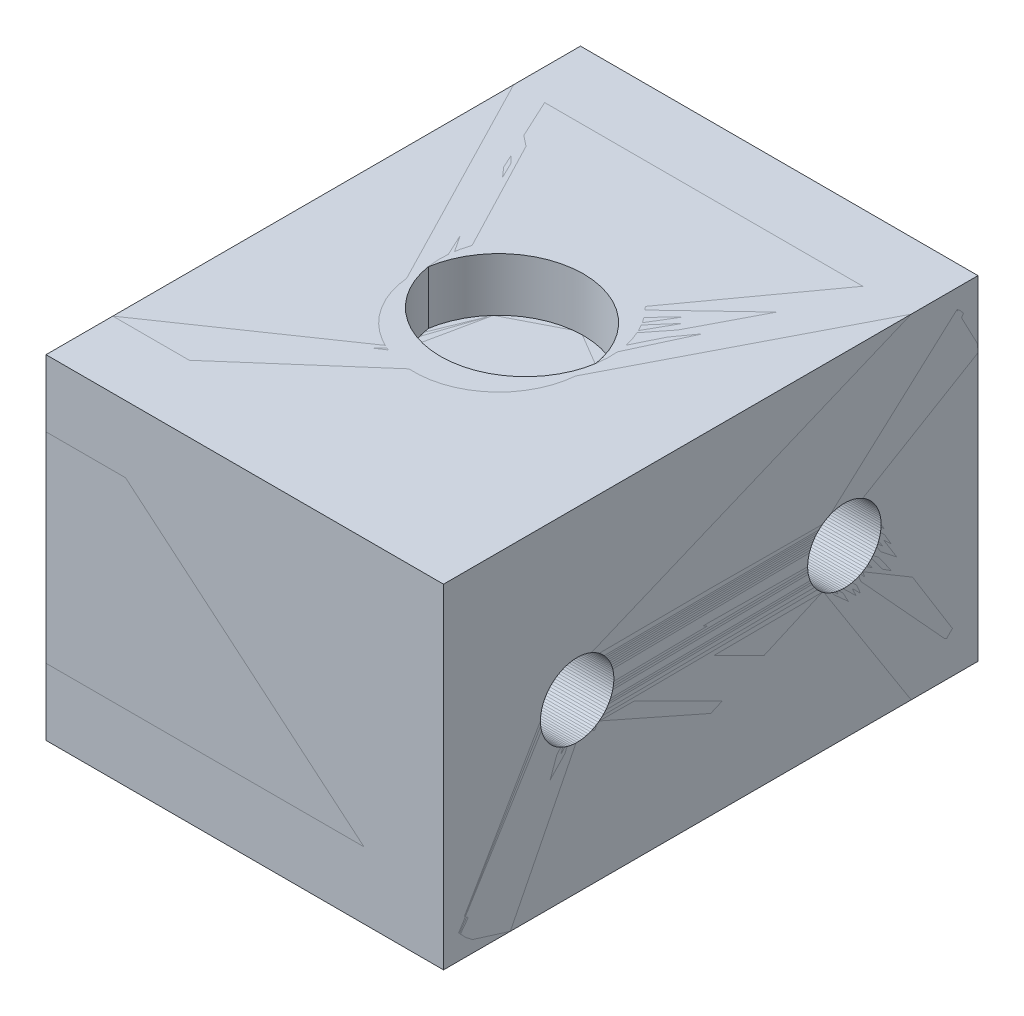
ISO-10303-21;
HEADER;
FILE_DESCRIPTION(('STEP AP214'),'2;1');
FILE_NAME('part.step','',(''),(''),'','','');
FILE_SCHEMA(('AUTOMOTIVE_DESIGN { 1 0 10303 214 1 1 1 1 }'));
ENDSEC;
DATA;
#1=APPLICATION_CONTEXT('core data for automotive mechanical design processes');
#2=APPLICATION_PROTOCOL_DEFINITION('international standard','automotive_design',2000,#1);
#3=PRODUCT_CONTEXT('',#1,'mechanical');
#4=PRODUCT('Part','Part','',(#3));
#5=PRODUCT_RELATED_PRODUCT_CATEGORY('part','',(#4));
#6=PRODUCT_DEFINITION_FORMATION('','',#4);
#7=PRODUCT_DEFINITION_CONTEXT('part definition',#1,'design');
#8=PRODUCT_DEFINITION('design','',#6,#7);
#9=PRODUCT_DEFINITION_SHAPE('','',#8);
#10=(LENGTH_UNIT() NAMED_UNIT(*) SI_UNIT(.MILLI.,.METRE.));
#11=(NAMED_UNIT(*) PLANE_ANGLE_UNIT() SI_UNIT($,.RADIAN.));
#12=(NAMED_UNIT(*) SI_UNIT($,.STERADIAN.) SOLID_ANGLE_UNIT());
#13=UNCERTAINTY_MEASURE_WITH_UNIT(LENGTH_MEASURE(1.E-05),#10,'distance_accuracy_value','');
#14=(GEOMETRIC_REPRESENTATION_CONTEXT(3) GLOBAL_UNCERTAINTY_ASSIGNED_CONTEXT((#13)) GLOBAL_UNIT_ASSIGNED_CONTEXT((#10,
#11,#12)) REPRESENTATION_CONTEXT('',''));
#15=CARTESIAN_POINT('',(0.,0.,0.));
#16=DIRECTION('',(0.,0.,1.));
#17=DIRECTION('',(1.,0.,0.));
#18=AXIS2_PLACEMENT_3D('',#15,#16,#17);
#19=CARTESIAN_POINT('',(0.,100.,0.));
#20=DIRECTION('',(1.,0.,0.));
#21=DIRECTION('',(0.,1.,0.));
#22=AXIS2_PLACEMENT_3D('',#19,#20,#21);
#23=PLANE('',#22);
#24=CARTESIAN_POINT('',(0.,87.5,-30.));
#25=DIRECTION('',(-1.,0.,0.));
#26=DIRECTION('',(0.,0.,1.));
#27=AXIS2_PLACEMENT_3D('',#24,#25,#26);
#28=CIRCLE('',#27,2.74999999999999);
#29=CARTESIAN_POINT('',(0.,87.5,-27.25));
#30=VERTEX_POINT('',#29);
#31=EDGE_CURVE('E175',#30,#30,#28,.T.);
#32=ORIENTED_EDGE('',*,*,#31,.T.);
#33=EDGE_LOOP('',(#32));
#34=FACE_BOUND('',#33,.T.);
#35=CARTESIAN_POINT('',(0.,87.5,-10.));
#36=DIRECTION('',(-1.,0.,0.));
#37=DIRECTION('',(0.,0.,1.));
#38=AXIS2_PLACEMENT_3D('',#35,#36,#37);
#39=CIRCLE('',#38,2.74999999999999);
#40=CARTESIAN_POINT('',(0.,87.5,-7.25000000000001));
#41=VERTEX_POINT('',#40);
#42=EDGE_CURVE('E169',#41,#41,#39,.T.);
#43=ORIENTED_EDGE('',*,*,#42,.T.);
#44=EDGE_LOOP('',(#43));
#45=FACE_BOUND('',#44,.T.);
#46=DIRECTION('',(0.,1.,0.));
#47=VECTOR('',#46,1.);
#48=CARTESIAN_POINT('',(0.,100.,-40.));
#49=LINE('',#48,#47);
#50=CARTESIAN_POINT('',(0.,80.,-40.));
#51=VERTEX_POINT('',#50);
#52=CARTESIAN_POINT('',(0.,95.,-40.));
#53=VERTEX_POINT('',#52);
#54=EDGE_CURVE('E152',#51,#53,#49,.T.);
#55=ORIENTED_EDGE('',*,*,#54,.T.);
#56=CARTESIAN_POINT('',(0.,95.,-35.));
#57=DIRECTION('',(-1.,0.,0.));
#58=DIRECTION('',(0.,1.,0.));
#59=AXIS2_PLACEMENT_3D('',#56,#57,#58);
#60=CIRCLE('',#59,5.);
#61=CARTESIAN_POINT('',(0.,100.,-35.));
#62=VERTEX_POINT('',#61);
#63=EDGE_CURVE('E125',#62,#53,#60,.T.);
#64=ORIENTED_EDGE('',*,*,#63,.F.);
#65=DIRECTION('',(0.,0.,-1.));
#66=VECTOR('',#65,1.);
#67=CARTESIAN_POINT('',(0.,100.,0.));
#68=LINE('',#67,#66);
#69=CARTESIAN_POINT('',(0.,100.,0.));
#70=VERTEX_POINT('',#69);
#71=EDGE_CURVE('E105',#70,#62,#68,.T.);
#72=ORIENTED_EDGE('',*,*,#71,.F.);
#73=DIRECTION('',(0.,1.,0.));
#74=VECTOR('',#73,1.);
#75=CARTESIAN_POINT('',(0.,100.,0.));
#76=LINE('',#75,#74);
#77=CARTESIAN_POINT('',(0.,75.,0.));
#78=VERTEX_POINT('',#77);
#79=EDGE_CURVE('E112',#78,#70,#76,.T.);
#80=ORIENTED_EDGE('',*,*,#79,.F.);
#81=DIRECTION('',(0.,0.,-1.));
#82=VECTOR('',#81,1.);
#83=CARTESIAN_POINT('',(0.,75.,0.));
#84=LINE('',#83,#82);
#85=CARTESIAN_POINT('',(0.,75.,-35.));
#86=VERTEX_POINT('',#85);
#87=EDGE_CURVE('E135',#78,#86,#84,.T.);
#88=ORIENTED_EDGE('',*,*,#87,.T.);
#89=CARTESIAN_POINT('',(0.,80.,-35.));
#90=DIRECTION('',(-1.,0.,0.));
#91=DIRECTION('',(0.,1.,0.));
#92=AXIS2_PLACEMENT_3D('',#89,#90,#91);
#93=CIRCLE('',#92,5.);
#94=EDGE_CURVE('E138',#51,#86,#93,.T.);
#95=ORIENTED_EDGE('',*,*,#94,.F.);
#96=EDGE_LOOP('',(#55,#64,#72,#80,#88,#95));
#97=FACE_BOUND('',#96,.T.);
#98=ADVANCED_FACE('F51',(#34,#45,#97),#23,.T.);
#99=CARTESIAN_POINT('',(0.,75.,0.));
#100=DIRECTION('',(0.,-1.,0.));
#101=DIRECTION('',(0.,0.,1.));
#102=AXIS2_PLACEMENT_3D('',#99,#100,#101);
#103=PLANE('',#102);
#104=ORIENTED_EDGE('',*,*,#87,.F.);
#105=DIRECTION('',(1.,0.,0.));
#106=VECTOR('',#105,1.);
#107=CARTESIAN_POINT('',(0.,75.,0.));
#108=LINE('',#107,#106);
#109=CARTESIAN_POINT('',(-29.75,75.,0.));
#110=VERTEX_POINT('',#109);
#111=EDGE_CURVE('E117',#110,#78,#108,.T.);
#112=ORIENTED_EDGE('',*,*,#111,.F.);
#113=DIRECTION('',(0.,0.,-1.));
#114=VECTOR('',#113,1.);
#115=CARTESIAN_POINT('',(-29.75,75.,0.));
#116=LINE('',#115,#114);
#117=CARTESIAN_POINT('',(-29.75,75.,-35.));
#118=VERTEX_POINT('',#117);
#119=EDGE_CURVE('E127',#110,#118,#116,.T.);
#120=ORIENTED_EDGE('',*,*,#119,.T.);
#121=DIRECTION('',(1.,0.,0.));
#122=VECTOR('',#121,1.);
#123=CARTESIAN_POINT('',(-29.75,75.,-35.));
#124=LINE('',#123,#122);
#125=EDGE_CURVE('E141',#86,#118,#124,.F.);
#126=ORIENTED_EDGE('',*,*,#125,.F.);
#127=EDGE_LOOP('',(#104,#112,#120,#126));
#128=FACE_BOUND('',#127,.T.);
#129=ADVANCED_FACE('F158',(#128),#103,.T.);
#130=CARTESIAN_POINT('',(-29.75,100.,0.));
#131=DIRECTION('',(-1.,0.,0.));
#132=DIRECTION('',(0.,0.,-1.));
#133=AXIS2_PLACEMENT_3D('',#130,#131,#132);
#134=PLANE('',#133);
#135=CARTESIAN_POINT('',(-29.75,87.5,-30.));
#136=DIRECTION('',(-1.,0.,0.));
#137=DIRECTION('',(0.,0.,1.));
#138=AXIS2_PLACEMENT_3D('',#135,#136,#137);
#139=CIRCLE('',#138,2.74999999999999);
#140=CARTESIAN_POINT('',(-29.75,87.5,-27.25));
#141=VERTEX_POINT('',#140);
#142=EDGE_CURVE('E172',#141,#141,#139,.T.);
#143=ORIENTED_EDGE('',*,*,#142,.F.);
#144=EDGE_LOOP('',(#143));
#145=FACE_BOUND('',#144,.T.);
#146=CARTESIAN_POINT('',(-29.75,87.5,-10.));
#147=DIRECTION('',(-1.,0.,0.));
#148=DIRECTION('',(0.,0.,1.));
#149=AXIS2_PLACEMENT_3D('',#146,#147,#148);
#150=CIRCLE('',#149,2.74999999999999);
#151=CARTESIAN_POINT('',(-29.75,87.5,-7.25000000000001));
#152=VERTEX_POINT('',#151);
#153=EDGE_CURVE('E164',#152,#152,#150,.T.);
#154=ORIENTED_EDGE('',*,*,#153,.F.);
#155=EDGE_LOOP('',(#154));
#156=FACE_BOUND('',#155,.T.);
#157=ORIENTED_EDGE('',*,*,#119,.F.);
#158=DIRECTION('',(0.,-1.,0.));
#159=VECTOR('',#158,1.);
#160=CARTESIAN_POINT('',(-29.75,100.,0.));
#161=LINE('',#160,#159);
#162=CARTESIAN_POINT('',(-29.75,100.,0.));
#163=VERTEX_POINT('',#162);
#164=EDGE_CURVE('E111',#163,#110,#161,.T.);
#165=ORIENTED_EDGE('',*,*,#164,.F.);
#166=DIRECTION('',(0.,0.,-1.));
#167=VECTOR('',#166,1.);
#168=CARTESIAN_POINT('',(-29.75,100.,0.));
#169=LINE('',#168,#167);
#170=CARTESIAN_POINT('',(-29.75,100.,-35.));
#171=VERTEX_POINT('',#170);
#172=EDGE_CURVE('E108',#163,#171,#169,.T.);
#173=ORIENTED_EDGE('',*,*,#172,.T.);
#174=CARTESIAN_POINT('',(-29.75,95.,-35.));
#175=DIRECTION('',(1.,0.,0.));
#176=DIRECTION('',(0.,0.,-1.));
#177=AXIS2_PLACEMENT_3D('',#174,#175,#176);
#178=CIRCLE('',#177,5.);
#179=CARTESIAN_POINT('',(-29.75,95.,-40.));
#180=VERTEX_POINT('',#179);
#181=EDGE_CURVE('E143',#180,#171,#178,.T.);
#182=ORIENTED_EDGE('',*,*,#181,.F.);
#183=DIRECTION('',(0.,-1.,0.));
#184=VECTOR('',#183,1.);
#185=CARTESIAN_POINT('',(-29.75,100.,-40.));
#186=LINE('',#185,#184);
#187=CARTESIAN_POINT('',(-29.75,80.,-40.));
#188=VERTEX_POINT('',#187);
#189=EDGE_CURVE('E121',#180,#188,#186,.T.);
#190=ORIENTED_EDGE('',*,*,#189,.T.);
#191=CARTESIAN_POINT('',(-29.75,80.,-35.));
#192=DIRECTION('',(1.,0.,0.));
#193=DIRECTION('',(0.,0.,-1.));
#194=AXIS2_PLACEMENT_3D('',#191,#192,#193);
#195=CIRCLE('',#194,5.);
#196=EDGE_CURVE('E59',#118,#188,#195,.T.);
#197=ORIENTED_EDGE('',*,*,#196,.F.);
#198=EDGE_LOOP('',(#157,#165,#173,#182,#190,#197));
#199=FACE_BOUND('',#198,.T.);
#200=ADVANCED_FACE('F150',(#145,#156,#199),#134,.T.);
#201=CARTESIAN_POINT('',(0.,100.,0.));
#202=DIRECTION('',(0.,1.,0.));
#203=DIRECTION('',(0.,0.,-1.));
#204=AXIS2_PLACEMENT_3D('',#201,#202,#203);
#205=PLANE('',#204);
#206=CARTESIAN_POINT('',(-14.875,100.,-19.));
#207=DIRECTION('',(0.,-1.,0.));
#208=DIRECTION('',(0.,0.,-1.));
#209=AXIS2_PLACEMENT_3D('',#206,#207,#208);
#210=CIRCLE('',#209,6.35);
#211=CARTESIAN_POINT('',(-14.875,100.,-25.35));
#212=VERTEX_POINT('',#211);
#213=EDGE_CURVE('E161',#212,#212,#210,.T.);
#214=ORIENTED_EDGE('',*,*,#213,.T.);
#215=EDGE_LOOP('',(#214));
#216=FACE_BOUND('',#215,.T.);
#217=ORIENTED_EDGE('',*,*,#172,.F.);
#218=DIRECTION('',(-1.,0.,0.));
#219=VECTOR('',#218,1.);
#220=CARTESIAN_POINT('',(0.,100.,0.));
#221=LINE('',#220,#219);
#222=EDGE_CURVE('E101',#70,#163,#221,.T.);
#223=ORIENTED_EDGE('',*,*,#222,.F.);
#224=ORIENTED_EDGE('',*,*,#71,.T.);
#225=DIRECTION('',(-1.,0.,0.));
#226=VECTOR('',#225,1.);
#227=CARTESIAN_POINT('',(0.,100.,-35.));
#228=LINE('',#227,#226);
#229=EDGE_CURVE('E12',#171,#62,#228,.F.);
#230=ORIENTED_EDGE('',*,*,#229,.F.);
#231=EDGE_LOOP('',(#217,#223,#224,#230));
#232=FACE_BOUND('',#231,.T.);
#233=ADVANCED_FACE('F103',(#216,#232),#205,.T.);
#234=CARTESIAN_POINT('',(0.,0.,0.));
#235=DIRECTION('',(0.,0.,1.));
#236=DIRECTION('',(-1.,0.,0.));
#237=AXIS2_PLACEMENT_3D('',#234,#235,#236);
#238=PLANE('',#237);
#239=ORIENTED_EDGE('',*,*,#79,.T.);
#240=ORIENTED_EDGE('',*,*,#222,.T.);
#241=ORIENTED_EDGE('',*,*,#164,.T.);
#242=ORIENTED_EDGE('',*,*,#111,.T.);
#243=EDGE_LOOP('',(#239,#240,#241,#242));
#244=FACE_BOUND('',#243,.T.);
#245=ADVANCED_FACE('F115',(#244),#238,.T.);
#246=CARTESIAN_POINT('',(0.,0.,-40.));
#247=DIRECTION('',(0.,0.,1.));
#248=DIRECTION('',(-1.,0.,0.));
#249=AXIS2_PLACEMENT_3D('',#246,#247,#248);
#250=PLANE('',#249);
#251=ORIENTED_EDGE('',*,*,#189,.F.);
#252=DIRECTION('',(-1.,0.,0.));
#253=VECTOR('',#252,1.);
#254=CARTESIAN_POINT('',(-29.75,95.,-40.));
#255=LINE('',#254,#253);
#256=EDGE_CURVE('E132',#53,#180,#255,.T.);
#257=ORIENTED_EDGE('',*,*,#256,.F.);
#258=ORIENTED_EDGE('',*,*,#54,.F.);
#259=DIRECTION('',(1.,0.,0.));
#260=VECTOR('',#259,1.);
#261=CARTESIAN_POINT('',(0.,80.,-40.));
#262=LINE('',#261,#260);
#263=EDGE_CURVE('E134',#188,#51,#262,.T.);
#264=ORIENTED_EDGE('',*,*,#263,.F.);
#265=EDGE_LOOP('',(#251,#257,#258,#264));
#266=FACE_BOUND('',#265,.T.);
#267=ADVANCED_FACE('F206',(#266),#250,.F.);
#268=CARTESIAN_POINT('',(-14.875,96.,-19.));
#269=DIRECTION('',(0.,1.,0.));
#270=DIRECTION('',(0.,0.,-1.));
#271=AXIS2_PLACEMENT_3D('',#268,#269,#270);
#272=CYLINDRICAL_SURFACE('',#271,6.35);
#273=CARTESIAN_POINT('',(-14.875,96.,-19.));
#274=DIRECTION('',(0.,-1.,0.));
#275=DIRECTION('',(0.,0.,-1.));
#276=AXIS2_PLACEMENT_3D('',#273,#274,#275);
#277=CIRCLE('',#276,6.35);
#278=CARTESIAN_POINT('',(-14.875,96.,-25.35));
#279=VERTEX_POINT('',#278);
#280=EDGE_CURVE('E154',#279,#279,#277,.T.);
#281=ORIENTED_EDGE('',*,*,#280,.T.);
#282=EDGE_LOOP('',(#281));
#283=FACE_BOUND('',#282,.T.);
#284=ORIENTED_EDGE('',*,*,#213,.F.);
#285=EDGE_LOOP('',(#284));
#286=FACE_BOUND('',#285,.T.);
#287=ADVANCED_FACE('F209',(#283,#286),#272,.F.);
#288=CARTESIAN_POINT('',(-14.875,96.,-19.));
#289=DIRECTION('',(0.,1.,0.));
#290=DIRECTION('',(0.,0.,-1.));
#291=AXIS2_PLACEMENT_3D('',#288,#289,#290);
#292=PLANE('',#291);
#293=ORIENTED_EDGE('',*,*,#280,.F.);
#294=EDGE_LOOP('',(#293));
#295=FACE_BOUND('',#294,.T.);
#296=ADVANCED_FACE('F190',(#295),#292,.T.);
#297=CARTESIAN_POINT('',(0.,87.5,-10.));
#298=DIRECTION('',(1.,0.,0.));
#299=DIRECTION('',(0.,0.,1.));
#300=AXIS2_PLACEMENT_3D('',#297,#298,#299);
#301=CYLINDRICAL_SURFACE('',#300,2.74999999999999);
#302=ORIENTED_EDGE('',*,*,#153,.T.);
#303=EDGE_LOOP('',(#302));
#304=FACE_BOUND('',#303,.T.);
#305=ORIENTED_EDGE('',*,*,#42,.F.);
#306=EDGE_LOOP('',(#305));
#307=FACE_BOUND('',#306,.T.);
#308=ADVANCED_FACE('F183',(#304,#307),#301,.F.);
#309=CARTESIAN_POINT('',(0.,87.5,-30.));
#310=DIRECTION('',(1.,0.,0.));
#311=DIRECTION('',(0.,0.,1.));
#312=AXIS2_PLACEMENT_3D('',#309,#310,#311);
#313=CYLINDRICAL_SURFACE('',#312,2.74999999999999);
#314=ORIENTED_EDGE('',*,*,#142,.T.);
#315=EDGE_LOOP('',(#314));
#316=FACE_BOUND('',#315,.T.);
#317=ORIENTED_EDGE('',*,*,#31,.F.);
#318=EDGE_LOOP('',(#317));
#319=FACE_BOUND('',#318,.T.);
#320=ADVANCED_FACE('F181',(#316,#319),#313,.F.);
#321=CARTESIAN_POINT('',(0.,80.,-35.));
#322=DIRECTION('',(-1.,0.,0.));
#323=DIRECTION('',(0.,0.,-1.));
#324=AXIS2_PLACEMENT_3D('',#321,#322,#323);
#325=CYLINDRICAL_SURFACE('',#324,5.);
#326=ORIENTED_EDGE('',*,*,#196,.T.);
#327=ORIENTED_EDGE('',*,*,#263,.T.);
#328=ORIENTED_EDGE('',*,*,#94,.T.);
#329=ORIENTED_EDGE('',*,*,#125,.T.);
#330=EDGE_LOOP('',(#326,#327,#328,#329));
#331=FACE_BOUND('',#330,.T.);
#332=ADVANCED_FACE('F145',(#331),#325,.T.);
#333=CARTESIAN_POINT('',(0.,95.,-35.));
#334=DIRECTION('',(1.,0.,0.));
#335=DIRECTION('',(0.,0.,1.));
#336=AXIS2_PLACEMENT_3D('',#333,#334,#335);
#337=CYLINDRICAL_SURFACE('',#336,5.);
#338=ORIENTED_EDGE('',*,*,#63,.T.);
#339=ORIENTED_EDGE('',*,*,#256,.T.);
#340=ORIENTED_EDGE('',*,*,#181,.T.);
#341=ORIENTED_EDGE('',*,*,#229,.T.);
#342=EDGE_LOOP('',(#338,#339,#340,#341));
#343=FACE_BOUND('',#342,.T.);
#344=ADVANCED_FACE('F53',(#343),#337,.T.);
#345=CLOSED_SHELL('',(#98,#129,#200,#233,#245,#267,#287,#296,#308,#320,#332,#344));
#346=MANIFOLD_SOLID_BREP('B2',#345);
#347=CARTESIAN_POINT('',(0.,100.,-40.));
#348=DIRECTION('',(1.,0.,0.));
#349=DIRECTION('',(0.,1.,0.));
#350=AXIS2_PLACEMENT_3D('',#347,#348,#349);
#351=PLANE('',#350);
#352=CARTESIAN_POINT('',(0.,87.5,-10.));
#353=DIRECTION('',(1.,0.,0.));
#354=DIRECTION('',(0.,0.,-1.));
#355=AXIS2_PLACEMENT_3D('',#352,#353,#354);
#356=CIRCLE('',#355,2.74999999999999);
#357=CARTESIAN_POINT('',(0.,87.5,-12.75));
#358=VERTEX_POINT('',#357);
#359=EDGE_CURVE('E459',#358,#358,#356,.T.);
#360=ORIENTED_EDGE('',*,*,#359,.F.);
#361=EDGE_LOOP('',(#360));
#362=FACE_BOUND('',#361,.T.);
#363=CARTESIAN_POINT('',(0.,87.5,-30.));
#364=DIRECTION('',(1.,0.,0.));
#365=DIRECTION('',(0.,0.,-1.));
#366=AXIS2_PLACEMENT_3D('',#363,#364,#365);
#367=CIRCLE('',#366,2.74999999999999);
#368=CARTESIAN_POINT('',(0.,87.5,-32.75));
#369=VERTEX_POINT('',#368);
#370=EDGE_CURVE('E461',#369,#369,#367,.T.);
#371=ORIENTED_EDGE('',*,*,#370,.F.);
#372=EDGE_LOOP('',(#371));
#373=FACE_BOUND('',#372,.T.);
#374=DIRECTION('',(0.,1.,0.));
#375=VECTOR('',#374,1.);
#376=CARTESIAN_POINT('',(0.,100.,0.));
#377=LINE('',#376,#375);
#378=CARTESIAN_POINT('',(0.,80.,0.));
#379=VERTEX_POINT('',#378);
#380=CARTESIAN_POINT('',(0.,95.,0.));
#381=VERTEX_POINT('',#380);
#382=EDGE_CURVE('E377',#379,#381,#377,.T.);
#383=ORIENTED_EDGE('',*,*,#382,.F.);
#384=CARTESIAN_POINT('',(0.,80.,-5.));
#385=DIRECTION('',(1.,0.,0.));
#386=DIRECTION('',(0.,1.,0.));
#387=AXIS2_PLACEMENT_3D('',#384,#385,#386);
#388=CIRCLE('',#387,5.);
#389=CARTESIAN_POINT('',(0.,75.,-5.));
#390=VERTEX_POINT('',#389);
#391=EDGE_CURVE('E400',#379,#390,#388,.T.);
#392=ORIENTED_EDGE('',*,*,#391,.T.);
#393=DIRECTION('',(0.,0.,1.));
#394=VECTOR('',#393,1.);
#395=CARTESIAN_POINT('',(0.,75.,-40.));
#396=LINE('',#395,#394);
#397=CARTESIAN_POINT('',(0.,75.,-40.));
#398=VERTEX_POINT('',#397);
#399=EDGE_CURVE('E373',#398,#390,#396,.T.);
#400=ORIENTED_EDGE('',*,*,#399,.F.);
#401=DIRECTION('',(0.,1.,0.));
#402=VECTOR('',#401,1.);
#403=CARTESIAN_POINT('',(0.,100.,-40.));
#404=LINE('',#403,#402);
#405=CARTESIAN_POINT('',(0.,100.,-40.));
#406=VERTEX_POINT('',#405);
#407=EDGE_CURVE('E367',#398,#406,#404,.T.);
#408=ORIENTED_EDGE('',*,*,#407,.T.);
#409=DIRECTION('',(0.,0.,1.));
#410=VECTOR('',#409,1.);
#411=CARTESIAN_POINT('',(0.,100.,-40.));
#412=LINE('',#411,#410);
#413=CARTESIAN_POINT('',(0.,100.,-5.));
#414=VERTEX_POINT('',#413);
#415=EDGE_CURVE('E351',#406,#414,#412,.T.);
#416=ORIENTED_EDGE('',*,*,#415,.T.);
#417=CARTESIAN_POINT('',(0.,95.,-5.));
#418=DIRECTION('',(1.,0.,0.));
#419=DIRECTION('',(0.,1.,0.));
#420=AXIS2_PLACEMENT_3D('',#417,#418,#419);
#421=CIRCLE('',#420,5.);
#422=EDGE_CURVE('E398',#414,#381,#421,.T.);
#423=ORIENTED_EDGE('',*,*,#422,.T.);
#424=EDGE_LOOP('',(#383,#392,#400,#408,#416,#423));
#425=FACE_BOUND('',#424,.T.);
#426=ADVANCED_FACE('F298',(#362,#373,#425),#351,.T.);
#427=CARTESIAN_POINT('',(0.,75.,-40.));
#428=DIRECTION('',(0.,-1.,0.));
#429=DIRECTION('',(0.,0.,-1.));
#430=AXIS2_PLACEMENT_3D('',#427,#428,#429);
#431=PLANE('',#430);
#432=ORIENTED_EDGE('',*,*,#399,.T.);
#433=DIRECTION('',(1.,0.,0.));
#434=VECTOR('',#433,1.);
#435=CARTESIAN_POINT('',(-29.75,75.,-5.));
#436=LINE('',#435,#434);
#437=CARTESIAN_POINT('',(-29.75,75.,-5.));
#438=VERTEX_POINT('',#437);
#439=EDGE_CURVE('E321',#390,#438,#436,.F.);
#440=ORIENTED_EDGE('',*,*,#439,.T.);
#441=DIRECTION('',(0.,0.,1.));
#442=VECTOR('',#441,1.);
#443=CARTESIAN_POINT('',(-29.75,75.,-40.));
#444=LINE('',#443,#442);
#445=CARTESIAN_POINT('',(-29.75,75.,-40.));
#446=VERTEX_POINT('',#445);
#447=EDGE_CURVE('E390',#446,#438,#444,.T.);
#448=ORIENTED_EDGE('',*,*,#447,.F.);
#449=DIRECTION('',(1.,0.,0.));
#450=VECTOR('',#449,1.);
#451=CARTESIAN_POINT('',(0.,75.,-40.));
#452=LINE('',#451,#450);
#453=EDGE_CURVE('E360',#446,#398,#452,.T.);
#454=ORIENTED_EDGE('',*,*,#453,.T.);
#455=EDGE_LOOP('',(#432,#440,#448,#454));
#456=FACE_BOUND('',#455,.T.);
#457=ADVANCED_FACE('F411',(#456),#431,.T.);
#458=CARTESIAN_POINT('',(-29.75,100.,-40.));
#459=DIRECTION('',(-1.,0.,0.));
#460=DIRECTION('',(0.,0.,1.));
#461=AXIS2_PLACEMENT_3D('',#458,#459,#460);
#462=PLANE('',#461);
#463=CARTESIAN_POINT('',(-29.75,87.5,-10.));
#464=DIRECTION('',(1.,0.,0.));
#465=DIRECTION('',(0.,0.,-1.));
#466=AXIS2_PLACEMENT_3D('',#463,#464,#465);
#467=CIRCLE('',#466,2.74999999999999);
#468=CARTESIAN_POINT('',(-29.75,87.5,-12.75));
#469=VERTEX_POINT('',#468);
#470=EDGE_CURVE('E457',#469,#469,#467,.T.);
#471=ORIENTED_EDGE('',*,*,#470,.T.);
#472=EDGE_LOOP('',(#471));
#473=FACE_BOUND('',#472,.T.);
#474=CARTESIAN_POINT('',(-29.75,87.5,-30.));
#475=DIRECTION('',(1.,0.,0.));
#476=DIRECTION('',(0.,0.,-1.));
#477=AXIS2_PLACEMENT_3D('',#474,#475,#476);
#478=CIRCLE('',#477,2.74999999999999);
#479=CARTESIAN_POINT('',(-29.75,87.5,-32.75));
#480=VERTEX_POINT('',#479);
#481=EDGE_CURVE('E466',#480,#480,#478,.T.);
#482=ORIENTED_EDGE('',*,*,#481,.T.);
#483=EDGE_LOOP('',(#482));
#484=FACE_BOUND('',#483,.T.);
#485=ORIENTED_EDGE('',*,*,#447,.T.);
#486=CARTESIAN_POINT('',(-29.75,80.,-5.));
#487=DIRECTION('',(-1.,0.,0.));
#488=DIRECTION('',(0.,0.,1.));
#489=AXIS2_PLACEMENT_3D('',#486,#487,#488);
#490=CIRCLE('',#489,5.);
#491=CARTESIAN_POINT('',(-29.75,80.,0.));
#492=VERTEX_POINT('',#491);
#493=EDGE_CURVE('E306',#438,#492,#490,.T.);
#494=ORIENTED_EDGE('',*,*,#493,.T.);
#495=DIRECTION('',(0.,-1.,0.));
#496=VECTOR('',#495,1.);
#497=CARTESIAN_POINT('',(-29.75,100.,0.));
#498=LINE('',#497,#496);
#499=CARTESIAN_POINT('',(-29.75,95.,0.));
#500=VERTEX_POINT('',#499);
#501=EDGE_CURVE('E374',#500,#492,#498,.T.);
#502=ORIENTED_EDGE('',*,*,#501,.F.);
#503=CARTESIAN_POINT('',(-29.75,95.,-5.));
#504=DIRECTION('',(-1.,0.,0.));
#505=DIRECTION('',(0.,0.,1.));
#506=AXIS2_PLACEMENT_3D('',#503,#504,#505);
#507=CIRCLE('',#506,5.);
#508=CARTESIAN_POINT('',(-29.75,100.,-5.));
#509=VERTEX_POINT('',#508);
#510=EDGE_CURVE('E313',#500,#509,#507,.T.);
#511=ORIENTED_EDGE('',*,*,#510,.T.);
#512=DIRECTION('',(0.,0.,1.));
#513=VECTOR('',#512,1.);
#514=CARTESIAN_POINT('',(-29.75,100.,-40.));
#515=LINE('',#514,#513);
#516=CARTESIAN_POINT('',(-29.75,100.,-40.));
#517=VERTEX_POINT('',#516);
#518=EDGE_CURVE('E359',#517,#509,#515,.T.);
#519=ORIENTED_EDGE('',*,*,#518,.F.);
#520=DIRECTION('',(0.,-1.,0.));
#521=VECTOR('',#520,1.);
#522=CARTESIAN_POINT('',(-29.75,100.,-40.));
#523=LINE('',#522,#521);
#524=EDGE_CURVE('E370',#517,#446,#523,.T.);
#525=ORIENTED_EDGE('',*,*,#524,.T.);
#526=EDGE_LOOP('',(#485,#494,#502,#511,#519,#525));
#527=FACE_BOUND('',#526,.T.);
#528=ADVANCED_FACE('F404',(#473,#484,#527),#462,.T.);
#529=CARTESIAN_POINT('',(0.,100.,-40.));
#530=DIRECTION('',(0.,1.,0.));
#531=DIRECTION('',(0.,0.,1.));
#532=AXIS2_PLACEMENT_3D('',#529,#530,#531);
#533=PLANE('',#532);
#534=CARTESIAN_POINT('',(-14.875,100.,-21.));
#535=DIRECTION('',(0.,1.,0.));
#536=DIRECTION('',(0.,0.,1.));
#537=AXIS2_PLACEMENT_3D('',#534,#535,#536);
#538=CIRCLE('',#537,6.35);
#539=CARTESIAN_POINT('',(-14.875,100.,-14.65));
#540=VERTEX_POINT('',#539);
#541=EDGE_CURVE('E380',#540,#540,#538,.T.);
#542=ORIENTED_EDGE('',*,*,#541,.F.);
#543=EDGE_LOOP('',(#542));
#544=FACE_BOUND('',#543,.T.);
#545=ORIENTED_EDGE('',*,*,#518,.T.);
#546=DIRECTION('',(-1.,0.,0.));
#547=VECTOR('',#546,1.);
#548=CARTESIAN_POINT('',(0.,100.,-5.));
#549=LINE('',#548,#547);
#550=EDGE_CURVE('E49',#509,#414,#549,.F.);
#551=ORIENTED_EDGE('',*,*,#550,.T.);
#552=ORIENTED_EDGE('',*,*,#415,.F.);
#553=DIRECTION('',(-1.,0.,0.));
#554=VECTOR('',#553,1.);
#555=CARTESIAN_POINT('',(0.,100.,-40.));
#556=LINE('',#555,#554);
#557=EDGE_CURVE('E354',#406,#517,#556,.T.);
#558=ORIENTED_EDGE('',*,*,#557,.T.);
#559=EDGE_LOOP('',(#545,#551,#552,#558));
#560=FACE_BOUND('',#559,.T.);
#561=ADVANCED_FACE('F353',(#544,#560),#533,.T.);
#562=CARTESIAN_POINT('',(0.,0.,-40.));
#563=DIRECTION('',(0.,0.,-1.));
#564=DIRECTION('',(-1.,0.,0.));
#565=AXIS2_PLACEMENT_3D('',#562,#563,#564);
#566=PLANE('',#565);
#567=ORIENTED_EDGE('',*,*,#407,.F.);
#568=ORIENTED_EDGE('',*,*,#453,.F.);
#569=ORIENTED_EDGE('',*,*,#524,.F.);
#570=ORIENTED_EDGE('',*,*,#557,.F.);
#571=EDGE_LOOP('',(#567,#568,#569,#570));
#572=FACE_BOUND('',#571,.T.);
#573=ADVANCED_FACE('F365',(#572),#566,.T.);
#574=CARTESIAN_POINT('',(0.,0.,0.));
#575=DIRECTION('',(0.,0.,-1.));
#576=DIRECTION('',(-1.,0.,0.));
#577=AXIS2_PLACEMENT_3D('',#574,#575,#576);
#578=PLANE('',#577);
#579=ORIENTED_EDGE('',*,*,#501,.T.);
#580=DIRECTION('',(1.,0.,0.));
#581=VECTOR('',#580,1.);
#582=CARTESIAN_POINT('',(0.,80.,0.));
#583=LINE('',#582,#581);
#584=EDGE_CURVE('E395',#492,#379,#583,.T.);
#585=ORIENTED_EDGE('',*,*,#584,.T.);
#586=ORIENTED_EDGE('',*,*,#382,.T.);
#587=DIRECTION('',(-1.,0.,0.));
#588=VECTOR('',#587,1.);
#589=CARTESIAN_POINT('',(-29.75,95.,0.));
#590=LINE('',#589,#588);
#591=EDGE_CURVE('E389',#381,#500,#590,.T.);
#592=ORIENTED_EDGE('',*,*,#591,.T.);
#593=EDGE_LOOP('',(#579,#585,#586,#592));
#594=FACE_BOUND('',#593,.T.);
#595=ADVANCED_FACE('F408',(#594),#578,.F.);
#596=CARTESIAN_POINT('',(-14.875,96.,-21.));
#597=DIRECTION('',(0.,1.,0.));
#598=DIRECTION('',(0.,0.,1.));
#599=AXIS2_PLACEMENT_3D('',#596,#597,#598);
#600=CYLINDRICAL_SURFACE('',#599,6.35);
#601=CARTESIAN_POINT('',(-14.875,96.,-21.));
#602=DIRECTION('',(0.,1.,0.));
#603=DIRECTION('',(0.,0.,1.));
#604=AXIS2_PLACEMENT_3D('',#601,#602,#603);
#605=CIRCLE('',#604,6.35);
#606=CARTESIAN_POINT('',(-14.875,96.,-14.65));
#607=VERTEX_POINT('',#606);
#608=EDGE_CURVE('E386',#607,#607,#605,.T.);
#609=ORIENTED_EDGE('',*,*,#608,.F.);
#610=EDGE_LOOP('',(#609));
#611=FACE_BOUND('',#610,.T.);
#612=ORIENTED_EDGE('',*,*,#541,.T.);
#613=EDGE_LOOP('',(#612));
#614=FACE_BOUND('',#613,.T.);
#615=ADVANCED_FACE('F436',(#611,#614),#600,.F.);
#616=CARTESIAN_POINT('',(-14.875,96.,-21.));
#617=DIRECTION('',(0.,1.,0.));
#618=DIRECTION('',(0.,0.,1.));
#619=AXIS2_PLACEMENT_3D('',#616,#617,#618);
#620=PLANE('',#619);
#621=ORIENTED_EDGE('',*,*,#608,.T.);
#622=EDGE_LOOP('',(#621));
#623=FACE_BOUND('',#622,.T.);
#624=ADVANCED_FACE('F441',(#623),#620,.T.);
#625=CARTESIAN_POINT('',(0.,87.5,-30.));
#626=DIRECTION('',(1.,0.,0.));
#627=DIRECTION('',(0.,0.,-1.));
#628=AXIS2_PLACEMENT_3D('',#625,#626,#627);
#629=CYLINDRICAL_SURFACE('',#628,2.74999999999999);
#630=ORIENTED_EDGE('',*,*,#481,.F.);
#631=EDGE_LOOP('',(#630));
#632=FACE_BOUND('',#631,.T.);
#633=ORIENTED_EDGE('',*,*,#370,.T.);
#634=EDGE_LOOP('',(#633));
#635=FACE_BOUND('',#634,.T.);
#636=ADVANCED_FACE('F445',(#632,#635),#629,.F.);
#637=CARTESIAN_POINT('',(0.,87.5,-10.));
#638=DIRECTION('',(1.,0.,0.));
#639=DIRECTION('',(0.,0.,-1.));
#640=AXIS2_PLACEMENT_3D('',#637,#638,#639);
#641=CYLINDRICAL_SURFACE('',#640,2.74999999999999);
#642=ORIENTED_EDGE('',*,*,#470,.F.);
#643=EDGE_LOOP('',(#642));
#644=FACE_BOUND('',#643,.T.);
#645=ORIENTED_EDGE('',*,*,#359,.T.);
#646=EDGE_LOOP('',(#645));
#647=FACE_BOUND('',#646,.T.);
#648=ADVANCED_FACE('F417',(#644,#647),#641,.F.);
#649=CARTESIAN_POINT('',(0.,80.,-5.));
#650=DIRECTION('',(-1.,0.,0.));
#651=DIRECTION('',(0.,0.,1.));
#652=AXIS2_PLACEMENT_3D('',#649,#650,#651);
#653=CYLINDRICAL_SURFACE('',#652,5.);
#654=ORIENTED_EDGE('',*,*,#493,.F.);
#655=ORIENTED_EDGE('',*,*,#439,.F.);
#656=ORIENTED_EDGE('',*,*,#391,.F.);
#657=ORIENTED_EDGE('',*,*,#584,.F.);
#658=EDGE_LOOP('',(#654,#655,#656,#657));
#659=FACE_BOUND('',#658,.T.);
#660=ADVANCED_FACE('F410',(#659),#653,.T.);
#661=CARTESIAN_POINT('',(0.,95.,-5.));
#662=DIRECTION('',(1.,0.,0.));
#663=DIRECTION('',(0.,0.,-1.));
#664=AXIS2_PLACEMENT_3D('',#661,#662,#663);
#665=CYLINDRICAL_SURFACE('',#664,5.);
#666=ORIENTED_EDGE('',*,*,#422,.F.);
#667=ORIENTED_EDGE('',*,*,#550,.F.);
#668=ORIENTED_EDGE('',*,*,#510,.F.);
#669=ORIENTED_EDGE('',*,*,#591,.F.);
#670=EDGE_LOOP('',(#666,#667,#668,#669));
#671=FACE_BOUND('',#670,.T.);
#672=ADVANCED_FACE('F300',(#671),#665,.T.);
#673=CLOSED_SHELL('',(#426,#457,#528,#561,#573,#595,#615,#624,#636,#648,#660,#672));
#674=MANIFOLD_SOLID_BREP('B6_NOT_SHOWN',#673);
#675=ADVANCED_BREP_SHAPE_REPRESENTATION('',(#18,#346,#674),#14);
#676=SHAPE_DEFINITION_REPRESENTATION(#9,#675);
ENDSEC;
END-ISO-10303-21;
